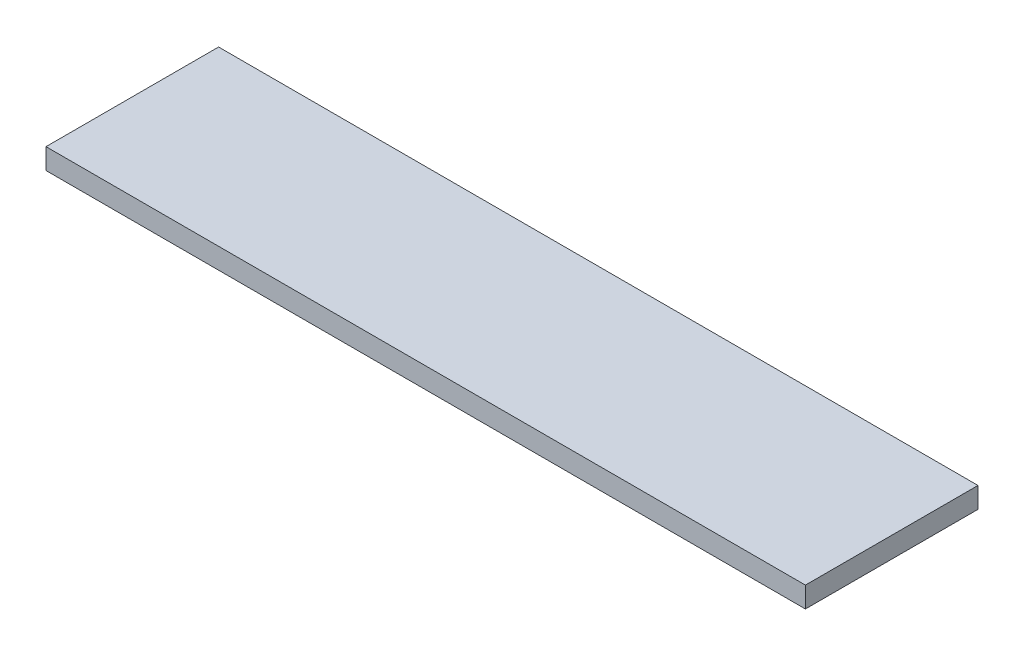
ISO-10303-21;
HEADER;
FILE_DESCRIPTION(('STEP AP214'),'2;1');
FILE_NAME('part.step','',(''),(''),'','','');
FILE_SCHEMA(('AUTOMOTIVE_DESIGN { 1 0 10303 214 1 1 1 1 }'));
ENDSEC;
DATA;
#1=APPLICATION_CONTEXT('core data for automotive mechanical design processes');
#2=APPLICATION_PROTOCOL_DEFINITION('international standard','automotive_design',2000,#1);
#3=PRODUCT_CONTEXT('',#1,'mechanical');
#4=PRODUCT('Part','Part','',(#3));
#5=PRODUCT_RELATED_PRODUCT_CATEGORY('part','',(#4));
#6=PRODUCT_DEFINITION_FORMATION('','',#4);
#7=PRODUCT_DEFINITION_CONTEXT('part definition',#1,'design');
#8=PRODUCT_DEFINITION('design','',#6,#7);
#9=PRODUCT_DEFINITION_SHAPE('','',#8);
#10=(LENGTH_UNIT() NAMED_UNIT(*) SI_UNIT(.MILLI.,.METRE.));
#11=(NAMED_UNIT(*) PLANE_ANGLE_UNIT() SI_UNIT($,.RADIAN.));
#12=(NAMED_UNIT(*) SI_UNIT($,.STERADIAN.) SOLID_ANGLE_UNIT());
#13=UNCERTAINTY_MEASURE_WITH_UNIT(LENGTH_MEASURE(1.E-05),#10,'distance_accuracy_value','');
#14=(GEOMETRIC_REPRESENTATION_CONTEXT(3) GLOBAL_UNCERTAINTY_ASSIGNED_CONTEXT((#13)) GLOBAL_UNIT_ASSIGNED_CONTEXT((#10,
#11,#12)) REPRESENTATION_CONTEXT('',''));
#15=CARTESIAN_POINT('',(0.,0.,0.));
#16=DIRECTION('',(0.,0.,1.));
#17=DIRECTION('',(1.,0.,0.));
#18=AXIS2_PLACEMENT_3D('',#15,#16,#17);
#19=CARTESIAN_POINT('',(55.,3.,12.5));
#20=DIRECTION('',(-1.,0.,0.));
#21=DIRECTION('',(0.,0.,1.));
#22=AXIS2_PLACEMENT_3D('',#19,#20,#21);
#23=PLANE('',#22);
#24=DIRECTION('',(0.,0.,-1.));
#25=VECTOR('',#24,1.);
#26=CARTESIAN_POINT('',(55.,0.,12.5));
#27=LINE('',#26,#25);
#28=CARTESIAN_POINT('',(55.,0.,12.5));
#29=VERTEX_POINT('',#28);
#30=CARTESIAN_POINT('',(55.,0.,-12.5));
#31=VERTEX_POINT('',#30);
#32=EDGE_CURVE('E96',#29,#31,#27,.T.);
#33=ORIENTED_EDGE('',*,*,#32,.T.);
#34=DIRECTION('',(0.,-1.,0.));
#35=VECTOR('',#34,1.);
#36=CARTESIAN_POINT('',(55.,3.,-12.5));
#37=LINE('',#36,#35);
#38=CARTESIAN_POINT('',(55.,3.,-12.5));
#39=VERTEX_POINT('',#38);
#40=EDGE_CURVE('E11',#39,#31,#37,.T.);
#41=ORIENTED_EDGE('',*,*,#40,.F.);
#42=DIRECTION('',(0.,0.,-1.));
#43=VECTOR('',#42,1.);
#44=CARTESIAN_POINT('',(55.,3.,12.5));
#45=LINE('',#44,#43);
#46=CARTESIAN_POINT('',(55.,3.,12.5));
#47=VERTEX_POINT('',#46);
#48=EDGE_CURVE('E84',#47,#39,#45,.T.);
#49=ORIENTED_EDGE('',*,*,#48,.F.);
#50=DIRECTION('',(0.,-1.,0.));
#51=VECTOR('',#50,1.);
#52=CARTESIAN_POINT('',(55.,3.,12.5));
#53=LINE('',#52,#51);
#54=EDGE_CURVE('E92',#47,#29,#53,.T.);
#55=ORIENTED_EDGE('',*,*,#54,.T.);
#56=EDGE_LOOP('',(#33,#41,#49,#55));
#57=FACE_BOUND('',#56,.T.);
#58=ADVANCED_FACE('F33',(#57),#23,.F.);
#59=CARTESIAN_POINT('',(-55.,3.,-12.5));
#60=DIRECTION('',(0.,0.,1.));
#61=DIRECTION('',(1.,0.,0.));
#62=AXIS2_PLACEMENT_3D('',#59,#60,#61);
#63=PLANE('',#62);
#64=DIRECTION('',(-1.,0.,0.));
#65=VECTOR('',#64,1.);
#66=CARTESIAN_POINT('',(-55.,0.,-12.5));
#67=LINE('',#66,#65);
#68=CARTESIAN_POINT('',(-55.,0.,-12.5));
#69=VERTEX_POINT('',#68);
#70=EDGE_CURVE('E88',#31,#69,#67,.T.);
#71=ORIENTED_EDGE('',*,*,#70,.T.);
#72=DIRECTION('',(0.,-1.,0.));
#73=VECTOR('',#72,1.);
#74=CARTESIAN_POINT('',(-55.,3.,-12.5));
#75=LINE('',#74,#73);
#76=CARTESIAN_POINT('',(-55.,3.,-12.5));
#77=VERTEX_POINT('',#76);
#78=EDGE_CURVE('E41',#77,#69,#75,.T.);
#79=ORIENTED_EDGE('',*,*,#78,.F.);
#80=DIRECTION('',(-1.,0.,0.));
#81=VECTOR('',#80,1.);
#82=CARTESIAN_POINT('',(-55.,3.,-12.5));
#83=LINE('',#82,#81);
#84=EDGE_CURVE('E79',#39,#77,#83,.T.);
#85=ORIENTED_EDGE('',*,*,#84,.F.);
#86=ORIENTED_EDGE('',*,*,#40,.T.);
#87=EDGE_LOOP('',(#71,#79,#85,#86));
#88=FACE_BOUND('',#87,.T.);
#89=ADVANCED_FACE('F87',(#88),#63,.F.);
#90=CARTESIAN_POINT('',(-55.,3.,12.5));
#91=DIRECTION('',(1.,0.,0.));
#92=DIRECTION('',(0.,0.,-1.));
#93=AXIS2_PLACEMENT_3D('',#90,#91,#92);
#94=PLANE('',#93);
#95=DIRECTION('',(0.,0.,1.));
#96=VECTOR('',#95,1.);
#97=CARTESIAN_POINT('',(-55.,0.,12.5));
#98=LINE('',#97,#96);
#99=CARTESIAN_POINT('',(-55.,0.,12.5));
#100=VERTEX_POINT('',#99);
#101=EDGE_CURVE('E66',#69,#100,#98,.T.);
#102=ORIENTED_EDGE('',*,*,#101,.T.);
#103=DIRECTION('',(0.,-1.,0.));
#104=VECTOR('',#103,1.);
#105=CARTESIAN_POINT('',(-55.,3.,12.5));
#106=LINE('',#105,#104);
#107=CARTESIAN_POINT('',(-55.,3.,12.5));
#108=VERTEX_POINT('',#107);
#109=EDGE_CURVE('E89',#108,#100,#106,.T.);
#110=ORIENTED_EDGE('',*,*,#109,.F.);
#111=DIRECTION('',(0.,0.,1.));
#112=VECTOR('',#111,1.);
#113=CARTESIAN_POINT('',(-55.,3.,12.5));
#114=LINE('',#113,#112);
#115=EDGE_CURVE('E82',#77,#108,#114,.T.);
#116=ORIENTED_EDGE('',*,*,#115,.F.);
#117=ORIENTED_EDGE('',*,*,#78,.T.);
#118=EDGE_LOOP('',(#102,#110,#116,#117));
#119=FACE_BOUND('',#118,.T.);
#120=ADVANCED_FACE('F90',(#119),#94,.F.);
#121=CARTESIAN_POINT('',(-55.,3.,12.5));
#122=DIRECTION('',(0.,0.,-1.));
#123=DIRECTION('',(-1.,0.,0.));
#124=AXIS2_PLACEMENT_3D('',#121,#122,#123);
#125=PLANE('',#124);
#126=DIRECTION('',(1.,0.,0.));
#127=VECTOR('',#126,1.);
#128=CARTESIAN_POINT('',(-55.,0.,12.5));
#129=LINE('',#128,#127);
#130=EDGE_CURVE('E72',#100,#29,#129,.T.);
#131=ORIENTED_EDGE('',*,*,#130,.T.);
#132=ORIENTED_EDGE('',*,*,#54,.F.);
#133=DIRECTION('',(1.,0.,0.));
#134=VECTOR('',#133,1.);
#135=CARTESIAN_POINT('',(-55.,3.,12.5));
#136=LINE('',#135,#134);
#137=EDGE_CURVE('E49',#108,#47,#136,.T.);
#138=ORIENTED_EDGE('',*,*,#137,.F.);
#139=ORIENTED_EDGE('',*,*,#109,.T.);
#140=EDGE_LOOP('',(#131,#132,#138,#139));
#141=FACE_BOUND('',#140,.T.);
#142=ADVANCED_FACE('F103',(#141),#125,.F.);
#143=CARTESIAN_POINT('',(0.,3.,0.));
#144=DIRECTION('',(0.,-1.,0.));
#145=DIRECTION('',(0.,0.,-1.));
#146=AXIS2_PLACEMENT_3D('',#143,#144,#145);
#147=PLANE('',#146);
#148=ORIENTED_EDGE('',*,*,#48,.T.);
#149=ORIENTED_EDGE('',*,*,#84,.T.);
#150=ORIENTED_EDGE('',*,*,#115,.T.);
#151=ORIENTED_EDGE('',*,*,#137,.T.);
#152=EDGE_LOOP('',(#148,#149,#150,#151));
#153=FACE_BOUND('',#152,.T.);
#154=ADVANCED_FACE('F80',(#153),#147,.F.);
#155=CARTESIAN_POINT('',(0.,0.,0.));
#156=DIRECTION('',(0.,-1.,0.));
#157=DIRECTION('',(0.,0.,-1.));
#158=AXIS2_PLACEMENT_3D('',#155,#156,#157);
#159=PLANE('',#158);
#160=ORIENTED_EDGE('',*,*,#32,.F.);
#161=ORIENTED_EDGE('',*,*,#130,.F.);
#162=ORIENTED_EDGE('',*,*,#101,.F.);
#163=ORIENTED_EDGE('',*,*,#70,.F.);
#164=EDGE_LOOP('',(#160,#161,#162,#163));
#165=FACE_BOUND('',#164,.T.);
#166=ADVANCED_FACE('F106',(#165),#159,.T.);
#167=CLOSED_SHELL('',(#58,#89,#120,#142,#154,#166));
#168=MANIFOLD_SOLID_BREP('B2',#167);
#169=ADVANCED_BREP_SHAPE_REPRESENTATION('',(#18,#168),#14);
#170=SHAPE_DEFINITION_REPRESENTATION(#9,#169);
ENDSEC;
END-ISO-10303-21;
